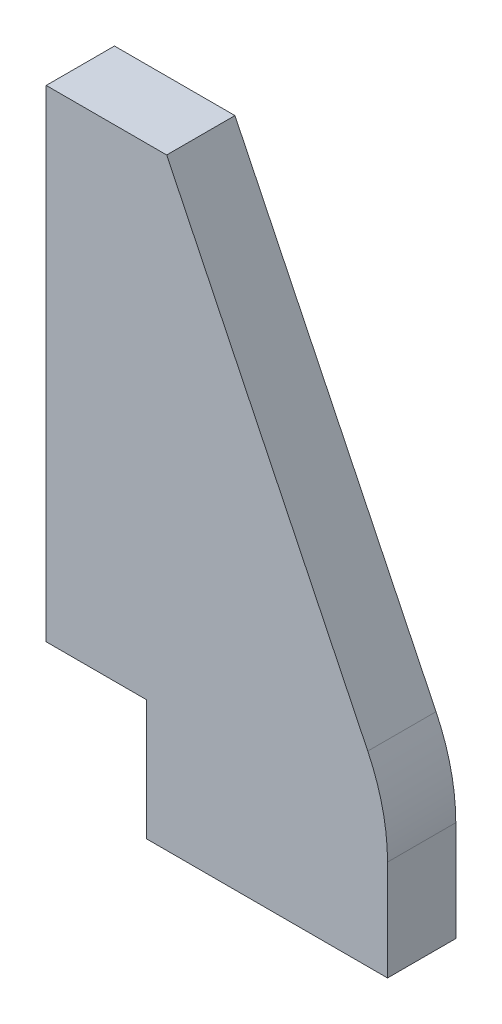
ISO-10303-21;
HEADER;
FILE_DESCRIPTION(('STEP AP214'),'2;1');
FILE_NAME('part.step','',(''),(''),'','','');
FILE_SCHEMA(('AUTOMOTIVE_DESIGN { 1 0 10303 214 1 1 1 1 }'));
ENDSEC;
DATA;
#1=APPLICATION_CONTEXT('core data for automotive mechanical design processes');
#2=APPLICATION_PROTOCOL_DEFINITION('international standard','automotive_design',2000,#1);
#3=PRODUCT_CONTEXT('',#1,'mechanical');
#4=PRODUCT('Part','Part','',(#3));
#5=PRODUCT_RELATED_PRODUCT_CATEGORY('part','',(#4));
#6=PRODUCT_DEFINITION_FORMATION('','',#4);
#7=PRODUCT_DEFINITION_CONTEXT('part definition',#1,'design');
#8=PRODUCT_DEFINITION('design','',#6,#7);
#9=PRODUCT_DEFINITION_SHAPE('','',#8);
#10=(LENGTH_UNIT() NAMED_UNIT(*) SI_UNIT(.MILLI.,.METRE.));
#11=(NAMED_UNIT(*) PLANE_ANGLE_UNIT() SI_UNIT($,.RADIAN.));
#12=(NAMED_UNIT(*) SI_UNIT($,.STERADIAN.) SOLID_ANGLE_UNIT());
#13=UNCERTAINTY_MEASURE_WITH_UNIT(LENGTH_MEASURE(1.E-05),#10,'distance_accuracy_value','');
#14=(GEOMETRIC_REPRESENTATION_CONTEXT(3) GLOBAL_UNCERTAINTY_ASSIGNED_CONTEXT((#13)) GLOBAL_UNIT_ASSIGNED_CONTEXT((#10,
#11,#12)) REPRESENTATION_CONTEXT('',''));
#15=CARTESIAN_POINT('',(0.,0.,0.));
#16=DIRECTION('',(0.,0.,1.));
#17=DIRECTION('',(1.,0.,0.));
#18=AXIS2_PLACEMENT_3D('',#15,#16,#17);
#19=CARTESIAN_POINT('',(0.,0.,17.));
#20=DIRECTION('',(1.,0.,0.));
#21=DIRECTION('',(0.,0.,-1.));
#22=AXIS2_PLACEMENT_3D('',#19,#20,#21);
#23=PLANE('',#22);
#24=DIRECTION('',(0.,-1.,0.));
#25=VECTOR('',#24,1.);
#26=CARTESIAN_POINT('',(0.,0.,0.));
#27=LINE('',#26,#25);
#28=CARTESIAN_POINT('',(0.,150.,0.));
#29=VERTEX_POINT('',#28);
#30=CARTESIAN_POINT('',(0.,30.,0.));
#31=VERTEX_POINT('',#30);
#32=EDGE_CURVE('E124',#29,#31,#27,.T.);
#33=ORIENTED_EDGE('',*,*,#32,.T.);
#34=DIRECTION('',(0.,0.,-1.));
#35=VECTOR('',#34,1.);
#36=CARTESIAN_POINT('',(0.,30.,17.));
#37=LINE('',#36,#35);
#38=CARTESIAN_POINT('',(0.,30.,17.));
#39=VERTEX_POINT('',#38);
#40=EDGE_CURVE('E47',#39,#31,#37,.T.);
#41=ORIENTED_EDGE('',*,*,#40,.F.);
#42=DIRECTION('',(0.,-1.,0.));
#43=VECTOR('',#42,1.);
#44=CARTESIAN_POINT('',(0.,0.,17.));
#45=LINE('',#44,#43);
#46=CARTESIAN_POINT('',(0.,150.,17.));
#47=VERTEX_POINT('',#46);
#48=EDGE_CURVE('E136',#47,#39,#45,.T.);
#49=ORIENTED_EDGE('',*,*,#48,.F.);
#50=DIRECTION('',(0.,0.,-1.));
#51=VECTOR('',#50,1.);
#52=CARTESIAN_POINT('',(0.,150.,17.));
#53=LINE('',#52,#51);
#54=EDGE_CURVE('E120',#47,#29,#53,.T.);
#55=ORIENTED_EDGE('',*,*,#54,.T.);
#56=EDGE_LOOP('',(#33,#41,#49,#55));
#57=FACE_BOUND('',#56,.T.);
#58=ADVANCED_FACE('F33',(#57),#23,.F.);
#59=CARTESIAN_POINT('',(0.,0.,17.));
#60=DIRECTION('',(0.,1.,0.));
#61=DIRECTION('',(0.,0.,1.));
#62=AXIS2_PLACEMENT_3D('',#59,#60,#61);
#63=PLANE('',#62);
#64=DIRECTION('',(1.,0.,0.));
#65=VECTOR('',#64,1.);
#66=CARTESIAN_POINT('',(0.,0.,17.));
#67=LINE('',#66,#65);
#68=CARTESIAN_POINT('',(25.,0.,17.));
#69=VERTEX_POINT('',#68);
#70=CARTESIAN_POINT('',(85.,0.,17.));
#71=VERTEX_POINT('',#70);
#72=EDGE_CURVE('E88',#69,#71,#67,.T.);
#73=ORIENTED_EDGE('',*,*,#72,.F.);
#74=DIRECTION('',(0.,0.,-1.));
#75=VECTOR('',#74,1.);
#76=CARTESIAN_POINT('',(25.,0.,17.));
#77=LINE('',#76,#75);
#78=CARTESIAN_POINT('',(25.,0.,0.));
#79=VERTEX_POINT('',#78);
#80=EDGE_CURVE('E128',#69,#79,#77,.T.);
#81=ORIENTED_EDGE('',*,*,#80,.T.);
#82=DIRECTION('',(1.,0.,0.));
#83=VECTOR('',#82,1.);
#84=CARTESIAN_POINT('',(0.,0.,0.));
#85=LINE('',#84,#83);
#86=CARTESIAN_POINT('',(85.,0.,0.));
#87=VERTEX_POINT('',#86);
#88=EDGE_CURVE('E127',#79,#87,#85,.T.);
#89=ORIENTED_EDGE('',*,*,#88,.T.);
#90=DIRECTION('',(0.,0.,-1.));
#91=VECTOR('',#90,1.);
#92=CARTESIAN_POINT('',(85.,0.,17.));
#93=LINE('',#92,#91);
#94=EDGE_CURVE('E11',#71,#87,#93,.T.);
#95=ORIENTED_EDGE('',*,*,#94,.F.);
#96=EDGE_LOOP('',(#73,#81,#89,#95));
#97=FACE_BOUND('',#96,.T.);
#98=ADVANCED_FACE('F178',(#97),#63,.F.);
#99=CARTESIAN_POINT('',(85.,0.,17.));
#100=DIRECTION('',(-1.,0.,0.));
#101=DIRECTION('',(0.,0.,1.));
#102=AXIS2_PLACEMENT_3D('',#99,#100,#101);
#103=PLANE('',#102);
#104=DIRECTION('',(0.,1.,0.));
#105=VECTOR('',#104,1.);
#106=CARTESIAN_POINT('',(85.,0.,0.));
#107=LINE('',#106,#105);
#108=CARTESIAN_POINT('',(85.,25.,0.));
#109=VERTEX_POINT('',#108);
#110=EDGE_CURVE('E130',#87,#109,#107,.T.);
#111=ORIENTED_EDGE('',*,*,#110,.T.);
#112=DIRECTION('',(0.,0.,-1.));
#113=VECTOR('',#112,1.);
#114=CARTESIAN_POINT('',(85.,25.,17.));
#115=LINE('',#114,#113);
#116=CARTESIAN_POINT('',(85.,25.,17.));
#117=VERTEX_POINT('',#116);
#118=EDGE_CURVE('E40',#117,#109,#115,.T.);
#119=ORIENTED_EDGE('',*,*,#118,.F.);
#120=DIRECTION('',(0.,1.,0.));
#121=VECTOR('',#120,1.);
#122=CARTESIAN_POINT('',(85.,0.,17.));
#123=LINE('',#122,#121);
#124=EDGE_CURVE('E104',#71,#117,#123,.T.);
#125=ORIENTED_EDGE('',*,*,#124,.F.);
#126=ORIENTED_EDGE('',*,*,#94,.T.);
#127=EDGE_LOOP('',(#111,#119,#125,#126));
#128=FACE_BOUND('',#127,.T.);
#129=ADVANCED_FACE('F179',(#128),#103,.F.);
#130=CARTESIAN_POINT('',(35.6818181818189,25.0000000000002,17.));
#131=DIRECTION('',(0.,0.,-1.));
#132=DIRECTION('',(-1.,0.,0.));
#133=AXIS2_PLACEMENT_3D('',#130,#131,#132);
#134=CYLINDRICAL_SURFACE('',#133,49.3181818181811);
#135=CARTESIAN_POINT('',(35.6818181818189,25.0000000000002,0.));
#136=DIRECTION('',(0.,0.,1.));
#137=DIRECTION('',(-1.,0.,0.));
#138=AXIS2_PLACEMENT_3D('',#135,#136,#137);
#139=CIRCLE('',#138,49.3181818181811);
#140=CARTESIAN_POINT('',(80.0783505154639,46.4762886597938,0.));
#141=VERTEX_POINT('',#140);
#142=EDGE_CURVE('E113',#109,#141,#139,.T.);
#143=ORIENTED_EDGE('',*,*,#142,.T.);
#144=DIRECTION('',(0.,0.,-1.));
#145=VECTOR('',#144,1.);
#146=CARTESIAN_POINT('',(80.0783505154639,46.4762886597938,17.));
#147=LINE('',#146,#145);
#148=CARTESIAN_POINT('',(80.0783505154639,46.4762886597938,17.));
#149=VERTEX_POINT('',#148);
#150=EDGE_CURVE('E110',#149,#141,#147,.T.);
#151=ORIENTED_EDGE('',*,*,#150,.F.);
#152=CARTESIAN_POINT('',(35.6818181818189,25.0000000000002,17.));
#153=DIRECTION('',(0.,0.,1.));
#154=DIRECTION('',(-1.,0.,0.));
#155=AXIS2_PLACEMENT_3D('',#152,#153,#154);
#156=CIRCLE('',#155,49.3181818181811);
#157=EDGE_CURVE('E96',#117,#149,#156,.T.);
#158=ORIENTED_EDGE('',*,*,#157,.F.);
#159=ORIENTED_EDGE('',*,*,#118,.T.);
#160=EDGE_LOOP('',(#143,#151,#158,#159));
#161=FACE_BOUND('',#160,.T.);
#162=ADVANCED_FACE('F111',(#161),#134,.T.);
#163=CARTESIAN_POINT('',(30.,150.,17.));
#164=DIRECTION('',(-0.90020618556701,-0.435463917525773,0.));
#165=DIRECTION('',(0.435463917525773,-0.90020618556701,0.));
#166=AXIS2_PLACEMENT_3D('',#163,#164,#165);
#167=PLANE('',#166);
#168=DIRECTION('',(-0.435463917525773,0.90020618556701,0.));
#169=VECTOR('',#168,1.);
#170=CARTESIAN_POINT('',(30.,150.,0.));
#171=LINE('',#170,#169);
#172=CARTESIAN_POINT('',(30.,150.,0.));
#173=VERTEX_POINT('',#172);
#174=EDGE_CURVE('E133',#141,#173,#171,.T.);
#175=ORIENTED_EDGE('',*,*,#174,.T.);
#176=DIRECTION('',(0.,0.,-1.));
#177=VECTOR('',#176,1.);
#178=CARTESIAN_POINT('',(30.,150.,17.));
#179=LINE('',#178,#177);
#180=CARTESIAN_POINT('',(30.,150.,17.));
#181=VERTEX_POINT('',#180);
#182=EDGE_CURVE('E116',#181,#173,#179,.T.);
#183=ORIENTED_EDGE('',*,*,#182,.F.);
#184=DIRECTION('',(-0.435463917525773,0.90020618556701,0.));
#185=VECTOR('',#184,1.);
#186=CARTESIAN_POINT('',(30.,150.,17.));
#187=LINE('',#186,#185);
#188=EDGE_CURVE('E101',#149,#181,#187,.T.);
#189=ORIENTED_EDGE('',*,*,#188,.F.);
#190=ORIENTED_EDGE('',*,*,#150,.T.);
#191=EDGE_LOOP('',(#175,#183,#189,#190));
#192=FACE_BOUND('',#191,.T.);
#193=ADVANCED_FACE('F118',(#192),#167,.F.);
#194=CARTESIAN_POINT('',(0.,150.,17.));
#195=DIRECTION('',(0.,-1.,0.));
#196=DIRECTION('',(0.,0.,-1.));
#197=AXIS2_PLACEMENT_3D('',#194,#195,#196);
#198=PLANE('',#197);
#199=DIRECTION('',(-1.,0.,0.));
#200=VECTOR('',#199,1.);
#201=CARTESIAN_POINT('',(0.,150.,0.));
#202=LINE('',#201,#200);
#203=EDGE_CURVE('E80',#173,#29,#202,.T.);
#204=ORIENTED_EDGE('',*,*,#203,.T.);
#205=ORIENTED_EDGE('',*,*,#54,.F.);
#206=DIRECTION('',(-1.,0.,0.));
#207=VECTOR('',#206,1.);
#208=CARTESIAN_POINT('',(0.,150.,17.));
#209=LINE('',#208,#207);
#210=EDGE_CURVE('E56',#181,#47,#209,.T.);
#211=ORIENTED_EDGE('',*,*,#210,.F.);
#212=ORIENTED_EDGE('',*,*,#182,.T.);
#213=EDGE_LOOP('',(#204,#205,#211,#212));
#214=FACE_BOUND('',#213,.T.);
#215=ADVANCED_FACE('F145',(#214),#198,.F.);
#216=CARTESIAN_POINT('',(35.6818181818189,25.0000000000002,17.));
#217=DIRECTION('',(0.,0.,-1.));
#218=DIRECTION('',(-1.,0.,0.));
#219=AXIS2_PLACEMENT_3D('',#216,#217,#218);
#220=PLANE('',#219);
#221=DIRECTION('',(1.,0.,0.));
#222=VECTOR('',#221,1.);
#223=CARTESIAN_POINT('',(0.,30.,17.));
#224=LINE('',#223,#222);
#225=CARTESIAN_POINT('',(25.,30.,17.));
#226=VERTEX_POINT('',#225);
#227=EDGE_CURVE('E162',#39,#226,#224,.T.);
#228=ORIENTED_EDGE('',*,*,#227,.T.);
#229=DIRECTION('',(0.,-1.,0.));
#230=VECTOR('',#229,1.);
#231=CARTESIAN_POINT('',(25.,0.,17.));
#232=LINE('',#231,#230);
#233=EDGE_CURVE('E154',#226,#69,#232,.T.);
#234=ORIENTED_EDGE('',*,*,#233,.T.);
#235=ORIENTED_EDGE('',*,*,#72,.T.);
#236=ORIENTED_EDGE('',*,*,#124,.T.);
#237=ORIENTED_EDGE('',*,*,#157,.T.);
#238=ORIENTED_EDGE('',*,*,#188,.T.);
#239=ORIENTED_EDGE('',*,*,#210,.T.);
#240=ORIENTED_EDGE('',*,*,#48,.T.);
#241=EDGE_LOOP('',(#228,#234,#235,#236,#237,#238,#239,#240));
#242=FACE_BOUND('',#241,.T.);
#243=ADVANCED_FACE('F99',(#242),#220,.F.);
#244=CARTESIAN_POINT('',(35.6818181818189,25.0000000000002,0.));
#245=DIRECTION('',(0.,0.,-1.));
#246=DIRECTION('',(-1.,0.,0.));
#247=AXIS2_PLACEMENT_3D('',#244,#245,#246);
#248=PLANE('',#247);
#249=DIRECTION('',(0.,-1.,0.));
#250=VECTOR('',#249,1.);
#251=CARTESIAN_POINT('',(25.,0.,0.));
#252=LINE('',#251,#250);
#253=CARTESIAN_POINT('',(25.,30.,0.));
#254=VERTEX_POINT('',#253);
#255=EDGE_CURVE('E159',#254,#79,#252,.T.);
#256=ORIENTED_EDGE('',*,*,#255,.F.);
#257=DIRECTION('',(1.,0.,0.));
#258=VECTOR('',#257,1.);
#259=CARTESIAN_POINT('',(0.,30.,0.));
#260=LINE('',#259,#258);
#261=EDGE_CURVE('E163',#31,#254,#260,.T.);
#262=ORIENTED_EDGE('',*,*,#261,.F.);
#263=ORIENTED_EDGE('',*,*,#32,.F.);
#264=ORIENTED_EDGE('',*,*,#203,.F.);
#265=ORIENTED_EDGE('',*,*,#174,.F.);
#266=ORIENTED_EDGE('',*,*,#142,.F.);
#267=ORIENTED_EDGE('',*,*,#110,.F.);
#268=ORIENTED_EDGE('',*,*,#88,.F.);
#269=EDGE_LOOP('',(#256,#262,#263,#264,#265,#266,#267,#268));
#270=FACE_BOUND('',#269,.T.);
#271=ADVANCED_FACE('F142',(#270),#248,.T.);
#272=CARTESIAN_POINT('',(25.,0.,17.));
#273=DIRECTION('',(1.,0.,0.));
#274=DIRECTION('',(0.,0.,-1.));
#275=AXIS2_PLACEMENT_3D('',#272,#273,#274);
#276=PLANE('',#275);
#277=ORIENTED_EDGE('',*,*,#255,.T.);
#278=ORIENTED_EDGE('',*,*,#80,.F.);
#279=ORIENTED_EDGE('',*,*,#233,.F.);
#280=DIRECTION('',(0.,0.,-1.));
#281=VECTOR('',#280,1.);
#282=CARTESIAN_POINT('',(25.,30.,17.));
#283=LINE('',#282,#281);
#284=EDGE_CURVE('E153',#226,#254,#283,.T.);
#285=ORIENTED_EDGE('',*,*,#284,.T.);
#286=EDGE_LOOP('',(#277,#278,#279,#285));
#287=FACE_BOUND('',#286,.T.);
#288=ADVANCED_FACE('F176',(#287),#276,.F.);
#289=CARTESIAN_POINT('',(0.,30.,17.));
#290=DIRECTION('',(0.,1.,0.));
#291=DIRECTION('',(0.,0.,1.));
#292=AXIS2_PLACEMENT_3D('',#289,#290,#291);
#293=PLANE('',#292);
#294=ORIENTED_EDGE('',*,*,#261,.T.);
#295=ORIENTED_EDGE('',*,*,#284,.F.);
#296=ORIENTED_EDGE('',*,*,#227,.F.);
#297=ORIENTED_EDGE('',*,*,#40,.T.);
#298=EDGE_LOOP('',(#294,#295,#296,#297));
#299=FACE_BOUND('',#298,.T.);
#300=ADVANCED_FACE('F170',(#299),#293,.F.);
#301=CLOSED_SHELL('',(#58,#98,#129,#162,#193,#215,#243,#271,#288,#300));
#302=MANIFOLD_SOLID_BREP('B2',#301);
#303=ADVANCED_BREP_SHAPE_REPRESENTATION('',(#18,#302),#14);
#304=SHAPE_DEFINITION_REPRESENTATION(#9,#303);
ENDSEC;
END-ISO-10303-21;
